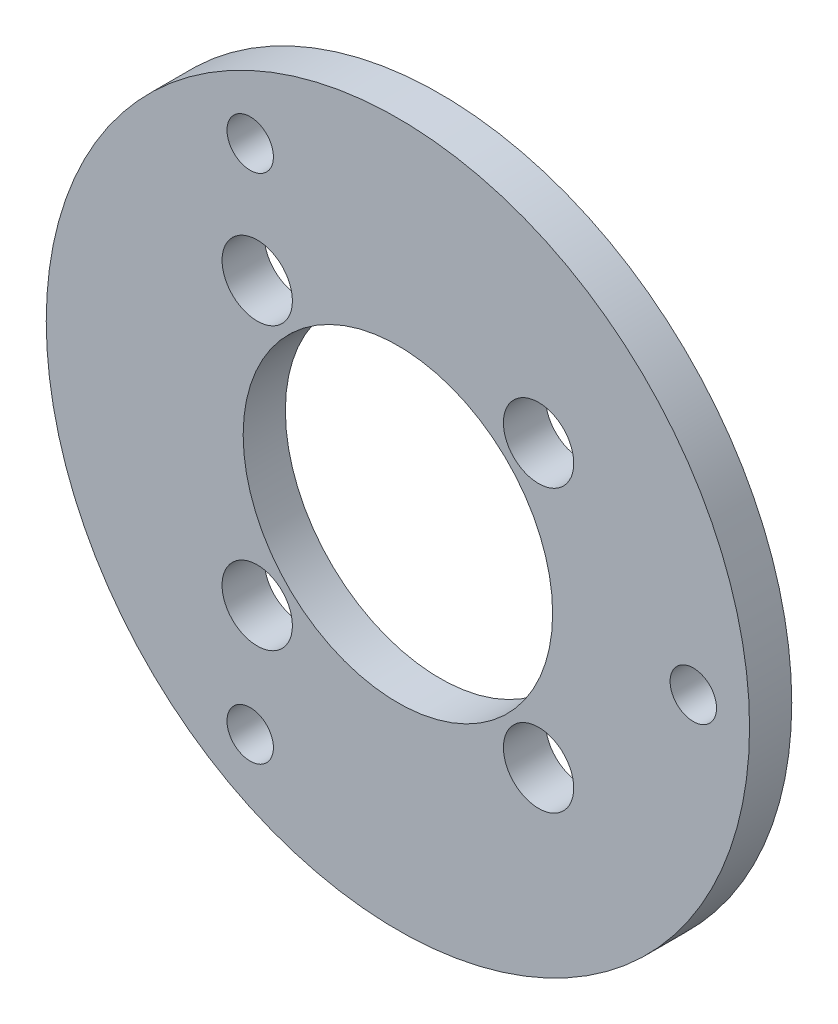
ISO-10303-21;
HEADER;
FILE_DESCRIPTION(('STEP AP214'),'2;1');
FILE_NAME('part.step','',(''),(''),'','','');
FILE_SCHEMA(('AUTOMOTIVE_DESIGN { 1 0 10303 214 1 1 1 1 }'));
ENDSEC;
DATA;
#1=APPLICATION_CONTEXT('core data for automotive mechanical design processes');
#2=APPLICATION_PROTOCOL_DEFINITION('international standard','automotive_design',2000,#1);
#3=PRODUCT_CONTEXT('',#1,'mechanical');
#4=PRODUCT('Part','Part','',(#3));
#5=PRODUCT_RELATED_PRODUCT_CATEGORY('part','',(#4));
#6=PRODUCT_DEFINITION_FORMATION('','',#4);
#7=PRODUCT_DEFINITION_CONTEXT('part definition',#1,'design');
#8=PRODUCT_DEFINITION('design','',#6,#7);
#9=PRODUCT_DEFINITION_SHAPE('','',#8);
#10=(LENGTH_UNIT() NAMED_UNIT(*) SI_UNIT(.MILLI.,.METRE.));
#11=(NAMED_UNIT(*) PLANE_ANGLE_UNIT() SI_UNIT($,.RADIAN.));
#12=(NAMED_UNIT(*) SI_UNIT($,.STERADIAN.) SOLID_ANGLE_UNIT());
#13=UNCERTAINTY_MEASURE_WITH_UNIT(LENGTH_MEASURE(1.E-05),#10,'distance_accuracy_value','');
#14=(GEOMETRIC_REPRESENTATION_CONTEXT(3) GLOBAL_UNCERTAINTY_ASSIGNED_CONTEXT((#13)) GLOBAL_UNIT_ASSIGNED_CONTEXT((#10,
#11,#12)) REPRESENTATION_CONTEXT('',''));
#15=CARTESIAN_POINT('',(0.,0.,0.));
#16=DIRECTION('',(0.,0.,1.));
#17=DIRECTION('',(1.,0.,0.));
#18=AXIS2_PLACEMENT_3D('',#15,#16,#17);
#19=CARTESIAN_POINT('',(-10.,-10.,3.));
#20=DIRECTION('',(0.,0.,-1.));
#21=DIRECTION('',(-1.,0.,0.));
#22=AXIS2_PLACEMENT_3D('',#19,#20,#21);
#23=CYLINDRICAL_SURFACE('',#22,2.5);
#24=CARTESIAN_POINT('',(-10.,-10.,3.));
#25=DIRECTION('',(0.,0.,1.));
#26=DIRECTION('',(1.,0.,0.));
#27=AXIS2_PLACEMENT_3D('',#24,#25,#26);
#28=CIRCLE('',#27,2.5);
#29=CARTESIAN_POINT('',(-7.5,-10.,3.));
#30=VERTEX_POINT('',#29);
#31=EDGE_CURVE('E43',#30,#30,#28,.T.);
#32=ORIENTED_EDGE('',*,*,#31,.T.);
#33=EDGE_LOOP('',(#32));
#34=FACE_BOUND('',#33,.T.);
#35=CARTESIAN_POINT('',(-10.,-10.,0.));
#36=DIRECTION('',(0.,0.,1.));
#37=DIRECTION('',(1.,0.,0.));
#38=AXIS2_PLACEMENT_3D('',#35,#36,#37);
#39=CIRCLE('',#38,2.5);
#40=CARTESIAN_POINT('',(-7.5,-10.,0.));
#41=VERTEX_POINT('',#40);
#42=EDGE_CURVE('E72',#41,#41,#39,.T.);
#43=ORIENTED_EDGE('',*,*,#42,.F.);
#44=EDGE_LOOP('',(#43));
#45=FACE_BOUND('',#44,.T.);
#46=ADVANCED_FACE('F35',(#34,#45),#23,.F.);
#47=CARTESIAN_POINT('',(10.,-10.,3.));
#48=DIRECTION('',(0.,0.,-1.));
#49=DIRECTION('',(-1.,0.,0.));
#50=AXIS2_PLACEMENT_3D('',#47,#48,#49);
#51=CYLINDRICAL_SURFACE('',#50,2.5);
#52=CARTESIAN_POINT('',(10.,-10.,3.));
#53=DIRECTION('',(0.,0.,1.));
#54=DIRECTION('',(1.,0.,0.));
#55=AXIS2_PLACEMENT_3D('',#52,#53,#54);
#56=CIRCLE('',#55,2.5);
#57=CARTESIAN_POINT('',(12.5,-10.,3.));
#58=VERTEX_POINT('',#57);
#59=EDGE_CURVE('E48',#58,#58,#56,.F.);
#60=ORIENTED_EDGE('',*,*,#59,.F.);
#61=EDGE_LOOP('',(#60));
#62=FACE_BOUND('',#61,.T.);
#63=CARTESIAN_POINT('',(10.,-10.,0.));
#64=DIRECTION('',(0.,0.,1.));
#65=DIRECTION('',(1.,0.,0.));
#66=AXIS2_PLACEMENT_3D('',#63,#64,#65);
#67=CIRCLE('',#66,2.5);
#68=CARTESIAN_POINT('',(12.5,-10.,0.));
#69=VERTEX_POINT('',#68);
#70=EDGE_CURVE('E70',#69,#69,#67,.F.);
#71=ORIENTED_EDGE('',*,*,#70,.T.);
#72=EDGE_LOOP('',(#71));
#73=FACE_BOUND('',#72,.T.);
#74=ADVANCED_FACE('F105',(#62,#73),#51,.F.);
#75=CARTESIAN_POINT('',(10.,10.,3.));
#76=DIRECTION('',(0.,0.,-1.));
#77=DIRECTION('',(-1.,0.,0.));
#78=AXIS2_PLACEMENT_3D('',#75,#76,#77);
#79=CYLINDRICAL_SURFACE('',#78,2.5);
#80=CARTESIAN_POINT('',(10.,10.,3.));
#81=DIRECTION('',(0.,0.,1.));
#82=DIRECTION('',(1.,0.,0.));
#83=AXIS2_PLACEMENT_3D('',#80,#81,#82);
#84=CIRCLE('',#83,2.5);
#85=CARTESIAN_POINT('',(12.5,10.,3.));
#86=VERTEX_POINT('',#85);
#87=EDGE_CURVE('E97',#86,#86,#84,.T.);
#88=ORIENTED_EDGE('',*,*,#87,.T.);
#89=EDGE_LOOP('',(#88));
#90=FACE_BOUND('',#89,.T.);
#91=CARTESIAN_POINT('',(10.,10.,0.));
#92=DIRECTION('',(0.,0.,1.));
#93=DIRECTION('',(1.,0.,0.));
#94=AXIS2_PLACEMENT_3D('',#91,#92,#93);
#95=CIRCLE('',#94,2.5);
#96=CARTESIAN_POINT('',(12.5,10.,0.));
#97=VERTEX_POINT('',#96);
#98=EDGE_CURVE('E67',#97,#97,#95,.T.);
#99=ORIENTED_EDGE('',*,*,#98,.F.);
#100=EDGE_LOOP('',(#99));
#101=FACE_BOUND('',#100,.T.);
#102=ADVANCED_FACE('F108',(#90,#101),#79,.F.);
#103=CARTESIAN_POINT('',(0.,0.,3.));
#104=DIRECTION('',(0.,0.,-1.));
#105=DIRECTION('',(-1.,0.,0.));
#106=AXIS2_PLACEMENT_3D('',#103,#104,#105);
#107=CYLINDRICAL_SURFACE('',#106,25.);
#108=CARTESIAN_POINT('',(0.,0.,3.));
#109=DIRECTION('',(0.,0.,1.));
#110=DIRECTION('',(1.,0.,0.));
#111=AXIS2_PLACEMENT_3D('',#108,#109,#110);
#112=CIRCLE('',#111,25.);
#113=CARTESIAN_POINT('',(25.,0.,3.));
#114=VERTEX_POINT('',#113);
#115=EDGE_CURVE('E94',#114,#114,#112,.T.);
#116=ORIENTED_EDGE('',*,*,#115,.F.);
#117=EDGE_LOOP('',(#116));
#118=FACE_BOUND('',#117,.T.);
#119=CARTESIAN_POINT('',(0.,0.,0.));
#120=DIRECTION('',(0.,0.,1.));
#121=DIRECTION('',(1.,0.,0.));
#122=AXIS2_PLACEMENT_3D('',#119,#120,#121);
#123=CIRCLE('',#122,25.);
#124=CARTESIAN_POINT('',(25.,0.,0.));
#125=VERTEX_POINT('',#124);
#126=EDGE_CURVE('E64',#125,#125,#123,.T.);
#127=ORIENTED_EDGE('',*,*,#126,.T.);
#128=EDGE_LOOP('',(#127));
#129=FACE_BOUND('',#128,.T.);
#130=ADVANCED_FACE('F134',(#118,#129),#107,.T.);
#131=CARTESIAN_POINT('',(21.,0.,3.));
#132=DIRECTION('',(0.,0.,-1.));
#133=DIRECTION('',(-1.,0.,0.));
#134=AXIS2_PLACEMENT_3D('',#131,#132,#133);
#135=CYLINDRICAL_SURFACE('',#134,1.65);
#136=CARTESIAN_POINT('',(21.,0.,3.));
#137=DIRECTION('',(0.,0.,1.));
#138=DIRECTION('',(1.,0.,0.));
#139=AXIS2_PLACEMENT_3D('',#136,#137,#138);
#140=CIRCLE('',#139,1.65);
#141=CARTESIAN_POINT('',(22.65,0.,3.));
#142=VERTEX_POINT('',#141);
#143=EDGE_CURVE('E91',#142,#142,#140,.T.);
#144=ORIENTED_EDGE('',*,*,#143,.T.);
#145=EDGE_LOOP('',(#144));
#146=FACE_BOUND('',#145,.T.);
#147=CARTESIAN_POINT('',(21.,0.,0.));
#148=DIRECTION('',(0.,0.,1.));
#149=DIRECTION('',(1.,0.,0.));
#150=AXIS2_PLACEMENT_3D('',#147,#148,#149);
#151=CIRCLE('',#150,1.65);
#152=CARTESIAN_POINT('',(22.65,0.,0.));
#153=VERTEX_POINT('',#152);
#154=EDGE_CURVE('E61',#153,#153,#151,.T.);
#155=ORIENTED_EDGE('',*,*,#154,.F.);
#156=EDGE_LOOP('',(#155));
#157=FACE_BOUND('',#156,.T.);
#158=ADVANCED_FACE('F138',(#146,#157),#135,.F.);
#159=CARTESIAN_POINT('',(0.,0.,3.));
#160=DIRECTION('',(0.,0.,-1.));
#161=DIRECTION('',(-1.,0.,0.));
#162=AXIS2_PLACEMENT_3D('',#159,#160,#161);
#163=CYLINDRICAL_SURFACE('',#162,11.);
#164=CARTESIAN_POINT('',(0.,0.,3.));
#165=DIRECTION('',(0.,0.,1.));
#166=DIRECTION('',(1.,0.,0.));
#167=AXIS2_PLACEMENT_3D('',#164,#165,#166);
#168=CIRCLE('',#167,11.);
#169=CARTESIAN_POINT('',(11.,0.,3.));
#170=VERTEX_POINT('',#169);
#171=EDGE_CURVE('E86',#170,#170,#168,.T.);
#172=ORIENTED_EDGE('',*,*,#171,.T.);
#173=EDGE_LOOP('',(#172));
#174=FACE_BOUND('',#173,.T.);
#175=CARTESIAN_POINT('',(0.,0.,0.));
#176=DIRECTION('',(0.,0.,1.));
#177=DIRECTION('',(1.,0.,0.));
#178=AXIS2_PLACEMENT_3D('',#175,#176,#177);
#179=CIRCLE('',#178,11.);
#180=CARTESIAN_POINT('',(11.,0.,0.));
#181=VERTEX_POINT('',#180);
#182=EDGE_CURVE('E58',#181,#181,#179,.T.);
#183=ORIENTED_EDGE('',*,*,#182,.F.);
#184=EDGE_LOOP('',(#183));
#185=FACE_BOUND('',#184,.T.);
#186=ADVANCED_FACE('F142',(#174,#185),#163,.F.);
#187=CARTESIAN_POINT('',(-10.5000000000001,-18.1865334794732,3.));
#188=DIRECTION('',(0.,0.,-1.));
#189=DIRECTION('',(-1.,0.,0.));
#190=AXIS2_PLACEMENT_3D('',#187,#188,#189);
#191=CYLINDRICAL_SURFACE('',#190,1.65);
#192=CARTESIAN_POINT('',(-10.5000000000001,-18.1865334794732,3.));
#193=DIRECTION('',(0.,0.,1.));
#194=DIRECTION('',(1.,0.,0.));
#195=AXIS2_PLACEMENT_3D('',#192,#193,#194);
#196=CIRCLE('',#195,1.65);
#197=CARTESIAN_POINT('',(-8.85000000000008,-18.1865334794732,3.));
#198=VERTEX_POINT('',#197);
#199=EDGE_CURVE('E81',#198,#198,#196,.T.);
#200=ORIENTED_EDGE('',*,*,#199,.T.);
#201=EDGE_LOOP('',(#200));
#202=FACE_BOUND('',#201,.T.);
#203=CARTESIAN_POINT('',(-10.5000000000001,-18.1865334794732,0.));
#204=DIRECTION('',(0.,0.,1.));
#205=DIRECTION('',(1.,0.,0.));
#206=AXIS2_PLACEMENT_3D('',#203,#204,#205);
#207=CIRCLE('',#206,1.65);
#208=CARTESIAN_POINT('',(-8.85000000000008,-18.1865334794732,0.));
#209=VERTEX_POINT('',#208);
#210=EDGE_CURVE('E55',#209,#209,#207,.T.);
#211=ORIENTED_EDGE('',*,*,#210,.F.);
#212=EDGE_LOOP('',(#211));
#213=FACE_BOUND('',#212,.T.);
#214=ADVANCED_FACE('F145',(#202,#213),#191,.F.);
#215=CARTESIAN_POINT('',(-10.5000000000001,18.1865334794732,3.));
#216=DIRECTION('',(0.,0.,-1.));
#217=DIRECTION('',(-1.,0.,0.));
#218=AXIS2_PLACEMENT_3D('',#215,#216,#217);
#219=CYLINDRICAL_SURFACE('',#218,1.65);
#220=CARTESIAN_POINT('',(-10.5000000000001,18.1865334794732,3.));
#221=DIRECTION('',(0.,0.,1.));
#222=DIRECTION('',(1.,0.,0.));
#223=AXIS2_PLACEMENT_3D('',#220,#221,#222);
#224=CIRCLE('',#223,1.65);
#225=CARTESIAN_POINT('',(-8.85000000000009,18.1865334794732,3.));
#226=VERTEX_POINT('',#225);
#227=EDGE_CURVE('E77',#226,#226,#224,.T.);
#228=ORIENTED_EDGE('',*,*,#227,.T.);
#229=EDGE_LOOP('',(#228));
#230=FACE_BOUND('',#229,.T.);
#231=CARTESIAN_POINT('',(-10.5000000000001,18.1865334794732,0.));
#232=DIRECTION('',(0.,0.,1.));
#233=DIRECTION('',(1.,0.,0.));
#234=AXIS2_PLACEMENT_3D('',#231,#232,#233);
#235=CIRCLE('',#234,1.65);
#236=CARTESIAN_POINT('',(-8.85000000000009,18.1865334794732,0.));
#237=VERTEX_POINT('',#236);
#238=EDGE_CURVE('E52',#237,#237,#235,.T.);
#239=ORIENTED_EDGE('',*,*,#238,.F.);
#240=EDGE_LOOP('',(#239));
#241=FACE_BOUND('',#240,.T.);
#242=ADVANCED_FACE('F37',(#230,#241),#219,.F.);
#243=CARTESIAN_POINT('',(-10.,10.,3.));
#244=DIRECTION('',(0.,0.,-1.));
#245=DIRECTION('',(-1.,0.,0.));
#246=AXIS2_PLACEMENT_3D('',#243,#244,#245);
#247=CYLINDRICAL_SURFACE('',#246,2.5);
#248=CARTESIAN_POINT('',(-10.,10.,3.));
#249=DIRECTION('',(0.,0.,1.));
#250=DIRECTION('',(1.,0.,0.));
#251=AXIS2_PLACEMENT_3D('',#248,#249,#250);
#252=CIRCLE('',#251,2.5);
#253=CARTESIAN_POINT('',(-7.5,10.,3.));
#254=VERTEX_POINT('',#253);
#255=EDGE_CURVE('E10',#254,#254,#252,.F.);
#256=ORIENTED_EDGE('',*,*,#255,.F.);
#257=EDGE_LOOP('',(#256));
#258=FACE_BOUND('',#257,.T.);
#259=CARTESIAN_POINT('',(-10.,10.,0.));
#260=DIRECTION('',(0.,0.,1.));
#261=DIRECTION('',(1.,0.,0.));
#262=AXIS2_PLACEMENT_3D('',#259,#260,#261);
#263=CIRCLE('',#262,2.5);
#264=CARTESIAN_POINT('',(-7.5,10.,0.));
#265=VERTEX_POINT('',#264);
#266=EDGE_CURVE('E39',#265,#265,#263,.F.);
#267=ORIENTED_EDGE('',*,*,#266,.T.);
#268=EDGE_LOOP('',(#267));
#269=FACE_BOUND('',#268,.T.);
#270=ADVANCED_FACE('F120',(#258,#269),#247,.F.);
#271=CARTESIAN_POINT('',(0.,0.,3.));
#272=DIRECTION('',(0.,0.,1.));
#273=DIRECTION('',(1.,0.,0.));
#274=AXIS2_PLACEMENT_3D('',#271,#272,#273);
#275=PLANE('',#274);
#276=ORIENTED_EDGE('',*,*,#227,.F.);
#277=EDGE_LOOP('',(#276));
#278=FACE_BOUND('',#277,.T.);
#279=ORIENTED_EDGE('',*,*,#199,.F.);
#280=EDGE_LOOP('',(#279));
#281=FACE_BOUND('',#280,.T.);
#282=ORIENTED_EDGE('',*,*,#171,.F.);
#283=EDGE_LOOP('',(#282));
#284=FACE_BOUND('',#283,.T.);
#285=ORIENTED_EDGE('',*,*,#143,.F.);
#286=EDGE_LOOP('',(#285));
#287=FACE_BOUND('',#286,.T.);
#288=ORIENTED_EDGE('',*,*,#115,.T.);
#289=EDGE_LOOP('',(#288));
#290=FACE_BOUND('',#289,.T.);
#291=ORIENTED_EDGE('',*,*,#87,.F.);
#292=EDGE_LOOP('',(#291));
#293=FACE_BOUND('',#292,.T.);
#294=ORIENTED_EDGE('',*,*,#59,.T.);
#295=EDGE_LOOP('',(#294));
#296=FACE_BOUND('',#295,.T.);
#297=ORIENTED_EDGE('',*,*,#31,.F.);
#298=EDGE_LOOP('',(#297));
#299=FACE_BOUND('',#298,.T.);
#300=ORIENTED_EDGE('',*,*,#255,.T.);
#301=EDGE_LOOP('',(#300));
#302=FACE_BOUND('',#301,.T.);
#303=ADVANCED_FACE('F102',(#278,#281,#284,#287,#290,#293,#296,#299,#302),#275,.T.);
#304=CARTESIAN_POINT('',(0.,0.,0.));
#305=DIRECTION('',(0.,0.,1.));
#306=DIRECTION('',(1.,0.,0.));
#307=AXIS2_PLACEMENT_3D('',#304,#305,#306);
#308=PLANE('',#307);
#309=ORIENTED_EDGE('',*,*,#238,.T.);
#310=EDGE_LOOP('',(#309));
#311=FACE_BOUND('',#310,.T.);
#312=ORIENTED_EDGE('',*,*,#210,.T.);
#313=EDGE_LOOP('',(#312));
#314=FACE_BOUND('',#313,.T.);
#315=ORIENTED_EDGE('',*,*,#182,.T.);
#316=EDGE_LOOP('',(#315));
#317=FACE_BOUND('',#316,.T.);
#318=ORIENTED_EDGE('',*,*,#154,.T.);
#319=EDGE_LOOP('',(#318));
#320=FACE_BOUND('',#319,.T.);
#321=ORIENTED_EDGE('',*,*,#126,.F.);
#322=EDGE_LOOP('',(#321));
#323=FACE_BOUND('',#322,.T.);
#324=ORIENTED_EDGE('',*,*,#98,.T.);
#325=EDGE_LOOP('',(#324));
#326=FACE_BOUND('',#325,.T.);
#327=ORIENTED_EDGE('',*,*,#70,.F.);
#328=EDGE_LOOP('',(#327));
#329=FACE_BOUND('',#328,.T.);
#330=ORIENTED_EDGE('',*,*,#42,.T.);
#331=EDGE_LOOP('',(#330));
#332=FACE_BOUND('',#331,.T.);
#333=ORIENTED_EDGE('',*,*,#266,.F.);
#334=EDGE_LOOP('',(#333));
#335=FACE_BOUND('',#334,.T.);
#336=ADVANCED_FACE('F112',(#311,#314,#317,#320,#323,#326,#329,#332,#335),#308,.F.);
#337=CLOSED_SHELL('',(#46,#74,#102,#130,#158,#186,#214,#242,#270,#303,#336));
#338=MANIFOLD_SOLID_BREP('B2',#337);
#339=ADVANCED_BREP_SHAPE_REPRESENTATION('',(#18,#338),#14);
#340=SHAPE_DEFINITION_REPRESENTATION(#9,#339);
ENDSEC;
END-ISO-10303-21;
